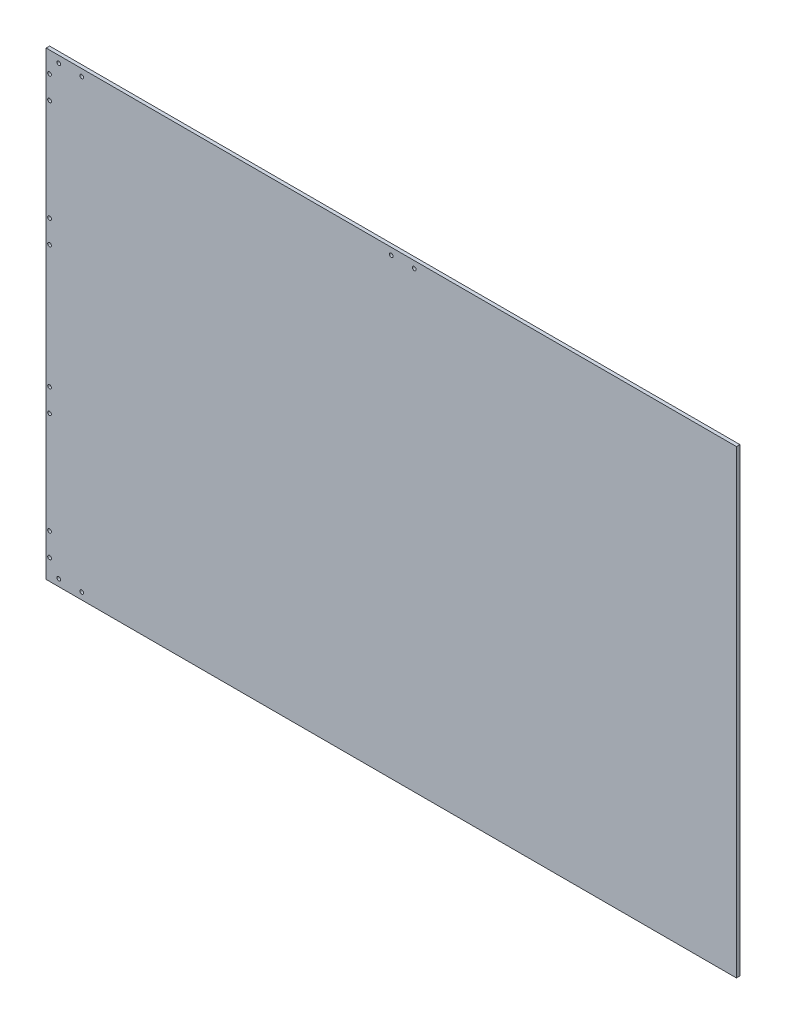
ISO-10303-21;
HEADER;
FILE_DESCRIPTION(('STEP AP214'),'2;1');
FILE_NAME('part.step','',(''),(''),'','','');
FILE_SCHEMA(('AUTOMOTIVE_DESIGN { 1 0 10303 214 1 1 1 1 }'));
ENDSEC;
DATA;
#1=APPLICATION_CONTEXT('core data for automotive mechanical design processes');
#2=APPLICATION_PROTOCOL_DEFINITION('international standard','automotive_design',2000,#1);
#3=PRODUCT_CONTEXT('',#1,'mechanical');
#4=PRODUCT('Part','Part','',(#3));
#5=PRODUCT_RELATED_PRODUCT_CATEGORY('part','',(#4));
#6=PRODUCT_DEFINITION_FORMATION('','',#4);
#7=PRODUCT_DEFINITION_CONTEXT('part definition',#1,'design');
#8=PRODUCT_DEFINITION('design','',#6,#7);
#9=PRODUCT_DEFINITION_SHAPE('','',#8);
#10=(LENGTH_UNIT() NAMED_UNIT(*) SI_UNIT(.MILLI.,.METRE.));
#11=(NAMED_UNIT(*) PLANE_ANGLE_UNIT() SI_UNIT($,.RADIAN.));
#12=(NAMED_UNIT(*) SI_UNIT($,.STERADIAN.) SOLID_ANGLE_UNIT());
#13=UNCERTAINTY_MEASURE_WITH_UNIT(LENGTH_MEASURE(1.E-05),#10,'distance_accuracy_value','');
#14=(GEOMETRIC_REPRESENTATION_CONTEXT(3) GLOBAL_UNCERTAINTY_ASSIGNED_CONTEXT((#13)) GLOBAL_UNIT_ASSIGNED_CONTEXT((#10,
#11,#12)) REPRESENTATION_CONTEXT('',''));
#15=CARTESIAN_POINT('',(0.,0.,0.));
#16=DIRECTION('',(0.,0.,1.));
#17=DIRECTION('',(1.,0.,0.));
#18=AXIS2_PLACEMENT_3D('',#15,#16,#17);
#19=CARTESIAN_POINT('',(300.,200.,3.));
#20=DIRECTION('',(-1.,0.,0.));
#21=DIRECTION('',(0.,0.,1.));
#22=AXIS2_PLACEMENT_3D('',#19,#20,#21);
#23=PLANE('',#22);
#24=DIRECTION('',(0.,1.,0.));
#25=VECTOR('',#24,1.);
#26=CARTESIAN_POINT('',(300.,200.,0.));
#27=LINE('',#26,#25);
#28=CARTESIAN_POINT('',(300.,-200.,0.));
#29=VERTEX_POINT('',#28);
#30=CARTESIAN_POINT('',(300.,200.,0.));
#31=VERTEX_POINT('',#30);
#32=EDGE_CURVE('E128',#29,#31,#27,.T.);
#33=ORIENTED_EDGE('',*,*,#32,.T.);
#34=DIRECTION('',(0.,0.,-1.));
#35=VECTOR('',#34,1.);
#36=CARTESIAN_POINT('',(300.,200.,3.));
#37=LINE('',#36,#35);
#38=CARTESIAN_POINT('',(300.,200.,3.));
#39=VERTEX_POINT('',#38);
#40=EDGE_CURVE('E12',#39,#31,#37,.T.);
#41=ORIENTED_EDGE('',*,*,#40,.F.);
#42=DIRECTION('',(0.,1.,0.));
#43=VECTOR('',#42,1.);
#44=CARTESIAN_POINT('',(300.,200.,3.));
#45=LINE('',#44,#43);
#46=CARTESIAN_POINT('',(300.,-200.,3.));
#47=VERTEX_POINT('',#46);
#48=EDGE_CURVE('E97',#47,#39,#45,.T.);
#49=ORIENTED_EDGE('',*,*,#48,.F.);
#50=DIRECTION('',(0.,0.,-1.));
#51=VECTOR('',#50,1.);
#52=CARTESIAN_POINT('',(300.,-200.,3.));
#53=LINE('',#52,#51);
#54=EDGE_CURVE('E108',#47,#29,#53,.T.);
#55=ORIENTED_EDGE('',*,*,#54,.T.);
#56=EDGE_LOOP('',(#33,#41,#49,#55));
#57=FACE_BOUND('',#56,.T.);
#58=ADVANCED_FACE('F46',(#57),#23,.F.);
#59=CARTESIAN_POINT('',(-300.,200.,3.));
#60=DIRECTION('',(0.,-1.,0.));
#61=DIRECTION('',(0.,0.,-1.));
#62=AXIS2_PLACEMENT_3D('',#59,#60,#61);
#63=PLANE('',#62);
#64=DIRECTION('',(-1.,0.,0.));
#65=VECTOR('',#64,1.);
#66=CARTESIAN_POINT('',(-300.,200.,0.));
#67=LINE('',#66,#65);
#68=CARTESIAN_POINT('',(-300.,200.,0.));
#69=VERTEX_POINT('',#68);
#70=EDGE_CURVE('E105',#31,#69,#67,.T.);
#71=ORIENTED_EDGE('',*,*,#70,.T.);
#72=DIRECTION('',(0.,0.,-1.));
#73=VECTOR('',#72,1.);
#74=CARTESIAN_POINT('',(-300.,200.,3.));
#75=LINE('',#74,#73);
#76=CARTESIAN_POINT('',(-300.,200.,3.));
#77=VERTEX_POINT('',#76);
#78=EDGE_CURVE('E53',#77,#69,#75,.T.);
#79=ORIENTED_EDGE('',*,*,#78,.F.);
#80=DIRECTION('',(-1.,0.,0.));
#81=VECTOR('',#80,1.);
#82=CARTESIAN_POINT('',(-300.,200.,3.));
#83=LINE('',#82,#81);
#84=EDGE_CURVE('E95',#39,#77,#83,.T.);
#85=ORIENTED_EDGE('',*,*,#84,.F.);
#86=ORIENTED_EDGE('',*,*,#40,.T.);
#87=EDGE_LOOP('',(#71,#79,#85,#86));
#88=FACE_BOUND('',#87,.T.);
#89=ADVANCED_FACE('F103',(#88),#63,.F.);
#90=CARTESIAN_POINT('',(-300.,200.,3.));
#91=DIRECTION('',(1.,0.,0.));
#92=DIRECTION('',(0.,0.,-1.));
#93=AXIS2_PLACEMENT_3D('',#90,#91,#92);
#94=PLANE('',#93);
#95=DIRECTION('',(0.,-1.,0.));
#96=VECTOR('',#95,1.);
#97=CARTESIAN_POINT('',(-300.,200.,0.));
#98=LINE('',#97,#96);
#99=CARTESIAN_POINT('',(-300.,-200.,0.));
#100=VERTEX_POINT('',#99);
#101=EDGE_CURVE('E79',#69,#100,#98,.T.);
#102=ORIENTED_EDGE('',*,*,#101,.T.);
#103=DIRECTION('',(0.,0.,-1.));
#104=VECTOR('',#103,1.);
#105=CARTESIAN_POINT('',(-300.,-200.,3.));
#106=LINE('',#105,#104);
#107=CARTESIAN_POINT('',(-300.,-200.,3.));
#108=VERTEX_POINT('',#107);
#109=EDGE_CURVE('E101',#108,#100,#106,.T.);
#110=ORIENTED_EDGE('',*,*,#109,.F.);
#111=DIRECTION('',(0.,-1.,0.));
#112=VECTOR('',#111,1.);
#113=CARTESIAN_POINT('',(-300.,200.,3.));
#114=LINE('',#113,#112);
#115=EDGE_CURVE('E93',#77,#108,#114,.T.);
#116=ORIENTED_EDGE('',*,*,#115,.F.);
#117=ORIENTED_EDGE('',*,*,#78,.T.);
#118=EDGE_LOOP('',(#102,#110,#116,#117));
#119=FACE_BOUND('',#118,.T.);
#120=ADVANCED_FACE('F104',(#119),#94,.F.);
#121=CARTESIAN_POINT('',(-300.,-200.,3.));
#122=DIRECTION('',(0.,1.,0.));
#123=DIRECTION('',(0.,0.,1.));
#124=AXIS2_PLACEMENT_3D('',#121,#122,#123);
#125=PLANE('',#124);
#126=DIRECTION('',(1.,0.,0.));
#127=VECTOR('',#126,1.);
#128=CARTESIAN_POINT('',(-300.,-200.,0.));
#129=LINE('',#128,#127);
#130=EDGE_CURVE('E83',#100,#29,#129,.T.);
#131=ORIENTED_EDGE('',*,*,#130,.T.);
#132=ORIENTED_EDGE('',*,*,#54,.F.);
#133=DIRECTION('',(1.,0.,0.));
#134=VECTOR('',#133,1.);
#135=CARTESIAN_POINT('',(-300.,-200.,3.));
#136=LINE('',#135,#134);
#137=EDGE_CURVE('E65',#108,#47,#136,.T.);
#138=ORIENTED_EDGE('',*,*,#137,.F.);
#139=ORIENTED_EDGE('',*,*,#109,.T.);
#140=EDGE_LOOP('',(#131,#132,#138,#139));
#141=FACE_BOUND('',#140,.T.);
#142=ADVANCED_FACE('F257',(#141),#125,.F.);
#143=CARTESIAN_POINT('',(0.,0.,3.));
#144=DIRECTION('',(0.,0.,1.));
#145=DIRECTION('',(1.,0.,0.));
#146=AXIS2_PLACEMENT_3D('',#143,#144,#145);
#147=PLANE('',#146);
#148=CARTESIAN_POINT('',(-297.,73.5000000000009,3.));
#149=DIRECTION('',(0.,0.,1.));
#150=DIRECTION('',(1.,0.,0.));
#151=AXIS2_PLACEMENT_3D('',#148,#149,#150);
#152=CIRCLE('',#151,1.59999999999997);
#153=CARTESIAN_POINT('',(-295.4,73.5000000000009,3.));
#154=VERTEX_POINT('',#153);
#155=EDGE_CURVE('E232',#154,#154,#152,.T.);
#156=ORIENTED_EDGE('',*,*,#155,.F.);
#157=EDGE_LOOP('',(#156));
#158=FACE_BOUND('',#157,.T.);
#159=CARTESIAN_POINT('',(-297.,53.5000000000009,3.));
#160=DIRECTION('',(0.,0.,1.));
#161=DIRECTION('',(1.,0.,0.));
#162=AXIS2_PLACEMENT_3D('',#159,#160,#161);
#163=CIRCLE('',#162,1.59999999999996);
#164=CARTESIAN_POINT('',(-295.4,53.5000000000009,3.));
#165=VERTEX_POINT('',#164);
#166=EDGE_CURVE('E229',#165,#165,#163,.T.);
#167=ORIENTED_EDGE('',*,*,#166,.F.);
#168=EDGE_LOOP('',(#167));
#169=FACE_BOUND('',#168,.T.);
#170=CARTESIAN_POINT('',(-297.,-53.4999999999992,3.));
#171=DIRECTION('',(0.,0.,1.));
#172=DIRECTION('',(1.,0.,0.));
#173=AXIS2_PLACEMENT_3D('',#170,#171,#172);
#174=CIRCLE('',#173,1.59999999999996);
#175=CARTESIAN_POINT('',(-295.4,-53.4999999999992,3.));
#176=VERTEX_POINT('',#175);
#177=EDGE_CURVE('E225',#176,#176,#174,.T.);
#178=ORIENTED_EDGE('',*,*,#177,.F.);
#179=EDGE_LOOP('',(#178));
#180=FACE_BOUND('',#179,.T.);
#181=CARTESIAN_POINT('',(-297.,-73.4999999999992,3.));
#182=DIRECTION('',(0.,0.,1.));
#183=DIRECTION('',(1.,0.,0.));
#184=AXIS2_PLACEMENT_3D('',#181,#182,#183);
#185=CIRCLE('',#184,1.59999999999997);
#186=CARTESIAN_POINT('',(-295.4,-73.4999999999992,3.));
#187=VERTEX_POINT('',#186);
#188=EDGE_CURVE('E213',#187,#187,#185,.T.);
#189=ORIENTED_EDGE('',*,*,#188,.F.);
#190=EDGE_LOOP('',(#189));
#191=FACE_BOUND('',#190,.T.);
#192=CARTESIAN_POINT('',(0.,194.,3.));
#193=DIRECTION('',(0.,0.,-1.));
#194=DIRECTION('',(-1.,0.,0.));
#195=AXIS2_PLACEMENT_3D('',#192,#193,#194);
#196=CIRCLE('',#195,1.59999999999999);
#197=CARTESIAN_POINT('',(-1.59999999999998,194.,3.));
#198=VERTEX_POINT('',#197);
#199=EDGE_CURVE('E140',#198,#198,#196,.T.);
#200=ORIENTED_EDGE('',*,*,#199,.T.);
#201=EDGE_LOOP('',(#200));
#202=FACE_BOUND('',#201,.T.);
#203=CARTESIAN_POINT('',(20.,194.,3.));
#204=DIRECTION('',(0.,0.,-1.));
#205=DIRECTION('',(-1.,0.,0.));
#206=AXIS2_PLACEMENT_3D('',#203,#204,#205);
#207=CIRCLE('',#206,1.59999999999999);
#208=CARTESIAN_POINT('',(18.4,194.,3.));
#209=VERTEX_POINT('',#208);
#210=EDGE_CURVE('E194',#209,#209,#207,.T.);
#211=ORIENTED_EDGE('',*,*,#210,.T.);
#212=EDGE_LOOP('',(#211));
#213=FACE_BOUND('',#212,.T.);
#214=CARTESIAN_POINT('',(-269.,194.000000000001,3.));
#215=DIRECTION('',(0.,0.,-1.));
#216=DIRECTION('',(-1.,0.,0.));
#217=AXIS2_PLACEMENT_3D('',#214,#215,#216);
#218=CIRCLE('',#217,1.59999999999996);
#219=CARTESIAN_POINT('',(-270.6,194.000000000001,3.));
#220=VERTEX_POINT('',#219);
#221=EDGE_CURVE('E133',#220,#220,#218,.T.);
#222=ORIENTED_EDGE('',*,*,#221,.T.);
#223=EDGE_LOOP('',(#222));
#224=FACE_BOUND('',#223,.T.);
#225=CARTESIAN_POINT('',(-289.,194.000000000001,3.));
#226=DIRECTION('',(0.,0.,-1.));
#227=DIRECTION('',(-1.,0.,0.));
#228=AXIS2_PLACEMENT_3D('',#225,#226,#227);
#229=CIRCLE('',#228,1.59999999999996);
#230=CARTESIAN_POINT('',(-290.6,194.000000000001,3.));
#231=VERTEX_POINT('',#230);
#232=EDGE_CURVE('E150',#231,#231,#229,.T.);
#233=ORIENTED_EDGE('',*,*,#232,.T.);
#234=EDGE_LOOP('',(#233));
#235=FACE_BOUND('',#234,.T.);
#236=CARTESIAN_POINT('',(-297.,182.,3.));
#237=DIRECTION('',(0.,0.,-1.));
#238=DIRECTION('',(-1.,0.,0.));
#239=AXIS2_PLACEMENT_3D('',#236,#237,#238);
#240=CIRCLE('',#239,1.59999999999996);
#241=CARTESIAN_POINT('',(-298.6,182.,3.));
#242=VERTEX_POINT('',#241);
#243=EDGE_CURVE('E155',#242,#242,#240,.T.);
#244=ORIENTED_EDGE('',*,*,#243,.T.);
#245=EDGE_LOOP('',(#244));
#246=FACE_BOUND('',#245,.T.);
#247=CARTESIAN_POINT('',(-297.,162.,3.));
#248=DIRECTION('',(0.,0.,-1.));
#249=DIRECTION('',(-1.,0.,0.));
#250=AXIS2_PLACEMENT_3D('',#247,#248,#249);
#251=CIRCLE('',#250,1.59999999999996);
#252=CARTESIAN_POINT('',(-298.6,162.,3.));
#253=VERTEX_POINT('',#252);
#254=EDGE_CURVE('E162',#253,#253,#251,.T.);
#255=ORIENTED_EDGE('',*,*,#254,.T.);
#256=EDGE_LOOP('',(#255));
#257=FACE_BOUND('',#256,.T.);
#258=CARTESIAN_POINT('',(-297.,-162.,3.));
#259=DIRECTION('',(0.,0.,-1.));
#260=DIRECTION('',(-1.,0.,0.));
#261=AXIS2_PLACEMENT_3D('',#258,#259,#260);
#262=CIRCLE('',#261,1.59999999999996);
#263=CARTESIAN_POINT('',(-298.6,-162.,3.));
#264=VERTEX_POINT('',#263);
#265=EDGE_CURVE('E175',#264,#264,#262,.T.);
#266=ORIENTED_EDGE('',*,*,#265,.T.);
#267=EDGE_LOOP('',(#266));
#268=FACE_BOUND('',#267,.T.);
#269=CARTESIAN_POINT('',(-297.,-182.,3.));
#270=DIRECTION('',(0.,0.,-1.));
#271=DIRECTION('',(-1.,0.,0.));
#272=AXIS2_PLACEMENT_3D('',#269,#270,#271);
#273=CIRCLE('',#272,1.59999999999996);
#274=CARTESIAN_POINT('',(-298.6,-182.,3.));
#275=VERTEX_POINT('',#274);
#276=EDGE_CURVE('E177',#275,#275,#273,.T.);
#277=ORIENTED_EDGE('',*,*,#276,.T.);
#278=EDGE_LOOP('',(#277));
#279=FACE_BOUND('',#278,.T.);
#280=CARTESIAN_POINT('',(-289.,-194.,3.));
#281=DIRECTION('',(0.,0.,-1.));
#282=DIRECTION('',(-1.,0.,0.));
#283=AXIS2_PLACEMENT_3D('',#280,#281,#282);
#284=CIRCLE('',#283,1.59999999999996);
#285=CARTESIAN_POINT('',(-290.6,-194.,3.));
#286=VERTEX_POINT('',#285);
#287=EDGE_CURVE('E190',#286,#286,#284,.T.);
#288=ORIENTED_EDGE('',*,*,#287,.T.);
#289=EDGE_LOOP('',(#288));
#290=FACE_BOUND('',#289,.T.);
#291=CARTESIAN_POINT('',(-269.,-194.,3.));
#292=DIRECTION('',(0.,0.,-1.));
#293=DIRECTION('',(-1.,0.,0.));
#294=AXIS2_PLACEMENT_3D('',#291,#292,#293);
#295=CIRCLE('',#294,1.59999999999996);
#296=CARTESIAN_POINT('',(-270.6,-194.,3.));
#297=VERTEX_POINT('',#296);
#298=EDGE_CURVE('E121',#297,#297,#295,.T.);
#299=ORIENTED_EDGE('',*,*,#298,.T.);
#300=EDGE_LOOP('',(#299));
#301=FACE_BOUND('',#300,.T.);
#302=ORIENTED_EDGE('',*,*,#48,.T.);
#303=ORIENTED_EDGE('',*,*,#84,.T.);
#304=ORIENTED_EDGE('',*,*,#115,.T.);
#305=ORIENTED_EDGE('',*,*,#137,.T.);
#306=EDGE_LOOP('',(#302,#303,#304,#305));
#307=FACE_BOUND('',#306,.T.);
#308=ADVANCED_FACE('F94',(#158,#169,#180,#191,#202,#213,#224,#235,#246,#257,#268,#279,#290,#301,
#307),#147,.T.);
#309=CARTESIAN_POINT('',(0.,0.,0.));
#310=DIRECTION('',(0.,0.,1.));
#311=DIRECTION('',(1.,0.,0.));
#312=AXIS2_PLACEMENT_3D('',#309,#310,#311);
#313=PLANE('',#312);
#314=CARTESIAN_POINT('',(-297.,73.5000000000009,0.));
#315=DIRECTION('',(0.,0.,1.));
#316=DIRECTION('',(1.,0.,0.));
#317=AXIS2_PLACEMENT_3D('',#314,#315,#316);
#318=CIRCLE('',#317,1.59999999999997);
#319=CARTESIAN_POINT('',(-295.4,73.5000000000009,0.));
#320=VERTEX_POINT('',#319);
#321=EDGE_CURVE('E200',#320,#320,#318,.T.);
#322=ORIENTED_EDGE('',*,*,#321,.T.);
#323=EDGE_LOOP('',(#322));
#324=FACE_BOUND('',#323,.T.);
#325=CARTESIAN_POINT('',(-297.,53.5000000000009,0.));
#326=DIRECTION('',(0.,0.,1.));
#327=DIRECTION('',(1.,0.,0.));
#328=AXIS2_PLACEMENT_3D('',#325,#326,#327);
#329=CIRCLE('',#328,1.59999999999996);
#330=CARTESIAN_POINT('',(-295.4,53.5000000000009,0.));
#331=VERTEX_POINT('',#330);
#332=EDGE_CURVE('E227',#331,#331,#329,.T.);
#333=ORIENTED_EDGE('',*,*,#332,.T.);
#334=EDGE_LOOP('',(#333));
#335=FACE_BOUND('',#334,.T.);
#336=CARTESIAN_POINT('',(-297.,-53.4999999999992,0.));
#337=DIRECTION('',(0.,0.,1.));
#338=DIRECTION('',(1.,0.,0.));
#339=AXIS2_PLACEMENT_3D('',#336,#337,#338);
#340=CIRCLE('',#339,1.59999999999996);
#341=CARTESIAN_POINT('',(-295.4,-53.4999999999992,0.));
#342=VERTEX_POINT('',#341);
#343=EDGE_CURVE('E216',#342,#342,#340,.T.);
#344=ORIENTED_EDGE('',*,*,#343,.T.);
#345=EDGE_LOOP('',(#344));
#346=FACE_BOUND('',#345,.T.);
#347=CARTESIAN_POINT('',(-297.,-73.4999999999992,0.));
#348=DIRECTION('',(0.,0.,1.));
#349=DIRECTION('',(1.,0.,0.));
#350=AXIS2_PLACEMENT_3D('',#347,#348,#349);
#351=CIRCLE('',#350,1.59999999999997);
#352=CARTESIAN_POINT('',(-295.4,-73.4999999999992,0.));
#353=VERTEX_POINT('',#352);
#354=EDGE_CURVE('E209',#353,#353,#351,.T.);
#355=ORIENTED_EDGE('',*,*,#354,.T.);
#356=EDGE_LOOP('',(#355));
#357=FACE_BOUND('',#356,.T.);
#358=CARTESIAN_POINT('',(0.,194.,0.));
#359=DIRECTION('',(0.,0.,-1.));
#360=DIRECTION('',(-1.,0.,0.));
#361=AXIS2_PLACEMENT_3D('',#358,#359,#360);
#362=CIRCLE('',#361,1.59999999999999);
#363=CARTESIAN_POINT('',(-1.59999999999998,194.,0.));
#364=VERTEX_POINT('',#363);
#365=EDGE_CURVE('E205',#364,#364,#362,.T.);
#366=ORIENTED_EDGE('',*,*,#365,.F.);
#367=EDGE_LOOP('',(#366));
#368=FACE_BOUND('',#367,.T.);
#369=CARTESIAN_POINT('',(20.,194.,0.));
#370=DIRECTION('',(0.,0.,-1.));
#371=DIRECTION('',(-1.,0.,0.));
#372=AXIS2_PLACEMENT_3D('',#369,#370,#371);
#373=CIRCLE('',#372,1.59999999999999);
#374=CARTESIAN_POINT('',(18.4,194.,0.));
#375=VERTEX_POINT('',#374);
#376=EDGE_CURVE('E197',#375,#375,#373,.T.);
#377=ORIENTED_EDGE('',*,*,#376,.F.);
#378=EDGE_LOOP('',(#377));
#379=FACE_BOUND('',#378,.T.);
#380=CARTESIAN_POINT('',(-269.,194.000000000001,0.));
#381=DIRECTION('',(0.,0.,-1.));
#382=DIRECTION('',(-1.,0.,0.));
#383=AXIS2_PLACEMENT_3D('',#380,#381,#382);
#384=CIRCLE('',#383,1.59999999999996);
#385=CARTESIAN_POINT('',(-270.6,194.000000000001,0.));
#386=VERTEX_POINT('',#385);
#387=EDGE_CURVE('E137',#386,#386,#384,.T.);
#388=ORIENTED_EDGE('',*,*,#387,.F.);
#389=EDGE_LOOP('',(#388));
#390=FACE_BOUND('',#389,.T.);
#391=CARTESIAN_POINT('',(-289.,194.000000000001,0.));
#392=DIRECTION('',(0.,0.,-1.));
#393=DIRECTION('',(-1.,0.,0.));
#394=AXIS2_PLACEMENT_3D('',#391,#392,#393);
#395=CIRCLE('',#394,1.59999999999996);
#396=CARTESIAN_POINT('',(-290.6,194.000000000001,0.));
#397=VERTEX_POINT('',#396);
#398=EDGE_CURVE('E154',#397,#397,#395,.T.);
#399=ORIENTED_EDGE('',*,*,#398,.F.);
#400=EDGE_LOOP('',(#399));
#401=FACE_BOUND('',#400,.T.);
#402=CARTESIAN_POINT('',(-297.,182.,0.));
#403=DIRECTION('',(0.,0.,-1.));
#404=DIRECTION('',(-1.,0.,0.));
#405=AXIS2_PLACEMENT_3D('',#402,#403,#404);
#406=CIRCLE('',#405,1.59999999999996);
#407=CARTESIAN_POINT('',(-298.6,182.,0.));
#408=VERTEX_POINT('',#407);
#409=EDGE_CURVE('E156',#408,#408,#406,.T.);
#410=ORIENTED_EDGE('',*,*,#409,.F.);
#411=EDGE_LOOP('',(#410));
#412=FACE_BOUND('',#411,.T.);
#413=CARTESIAN_POINT('',(-297.,162.,0.));
#414=DIRECTION('',(0.,0.,-1.));
#415=DIRECTION('',(-1.,0.,0.));
#416=AXIS2_PLACEMENT_3D('',#413,#414,#415);
#417=CIRCLE('',#416,1.59999999999996);
#418=CARTESIAN_POINT('',(-298.6,162.,0.));
#419=VERTEX_POINT('',#418);
#420=EDGE_CURVE('E170',#419,#419,#417,.T.);
#421=ORIENTED_EDGE('',*,*,#420,.F.);
#422=EDGE_LOOP('',(#421));
#423=FACE_BOUND('',#422,.T.);
#424=CARTESIAN_POINT('',(-297.,-162.,0.));
#425=DIRECTION('',(0.,0.,-1.));
#426=DIRECTION('',(-1.,0.,0.));
#427=AXIS2_PLACEMENT_3D('',#424,#425,#426);
#428=CIRCLE('',#427,1.59999999999996);
#429=CARTESIAN_POINT('',(-298.6,-162.,0.));
#430=VERTEX_POINT('',#429);
#431=EDGE_CURVE('E180',#430,#430,#428,.T.);
#432=ORIENTED_EDGE('',*,*,#431,.F.);
#433=EDGE_LOOP('',(#432));
#434=FACE_BOUND('',#433,.T.);
#435=CARTESIAN_POINT('',(-297.,-182.,0.));
#436=DIRECTION('',(0.,0.,-1.));
#437=DIRECTION('',(-1.,0.,0.));
#438=AXIS2_PLACEMENT_3D('',#435,#436,#437);
#439=CIRCLE('',#438,1.59999999999996);
#440=CARTESIAN_POINT('',(-298.6,-182.,0.));
#441=VERTEX_POINT('',#440);
#442=EDGE_CURVE('E183',#441,#441,#439,.T.);
#443=ORIENTED_EDGE('',*,*,#442,.F.);
#444=EDGE_LOOP('',(#443));
#445=FACE_BOUND('',#444,.T.);
#446=CARTESIAN_POINT('',(-289.,-194.,0.));
#447=DIRECTION('',(0.,0.,-1.));
#448=DIRECTION('',(-1.,0.,0.));
#449=AXIS2_PLACEMENT_3D('',#446,#447,#448);
#450=CIRCLE('',#449,1.59999999999996);
#451=CARTESIAN_POINT('',(-290.6,-194.,0.));
#452=VERTEX_POINT('',#451);
#453=EDGE_CURVE('E123',#452,#452,#450,.T.);
#454=ORIENTED_EDGE('',*,*,#453,.F.);
#455=EDGE_LOOP('',(#454));
#456=FACE_BOUND('',#455,.T.);
#457=CARTESIAN_POINT('',(-269.,-194.,0.));
#458=DIRECTION('',(0.,0.,-1.));
#459=DIRECTION('',(-1.,0.,0.));
#460=AXIS2_PLACEMENT_3D('',#457,#458,#459);
#461=CIRCLE('',#460,1.59999999999996);
#462=CARTESIAN_POINT('',(-270.6,-194.,0.));
#463=VERTEX_POINT('',#462);
#464=EDGE_CURVE('E125',#463,#463,#461,.T.);
#465=ORIENTED_EDGE('',*,*,#464,.F.);
#466=EDGE_LOOP('',(#465));
#467=FACE_BOUND('',#466,.T.);
#468=ORIENTED_EDGE('',*,*,#32,.F.);
#469=ORIENTED_EDGE('',*,*,#130,.F.);
#470=ORIENTED_EDGE('',*,*,#101,.F.);
#471=ORIENTED_EDGE('',*,*,#70,.F.);
#472=EDGE_LOOP('',(#468,#469,#470,#471));
#473=FACE_BOUND('',#472,.T.);
#474=ADVANCED_FACE('F242',(#324,#335,#346,#357,#368,#379,#390,#401,#412,#423,#434,#445,#456,
#467,#473),#313,.F.);
#475=CARTESIAN_POINT('',(-269.,-194.,3.));
#476=DIRECTION('',(0.,0.,-1.));
#477=DIRECTION('',(-1.,0.,0.));
#478=AXIS2_PLACEMENT_3D('',#475,#476,#477);
#479=CYLINDRICAL_SURFACE('',#478,1.59999999999996);
#480=ORIENTED_EDGE('',*,*,#298,.F.);
#481=EDGE_LOOP('',(#480));
#482=FACE_BOUND('',#481,.T.);
#483=ORIENTED_EDGE('',*,*,#464,.T.);
#484=EDGE_LOOP('',(#483));
#485=FACE_BOUND('',#484,.T.);
#486=ADVANCED_FACE('F285',(#482,#485),#479,.F.);
#487=CARTESIAN_POINT('',(-289.,-194.,3.));
#488=DIRECTION('',(0.,0.,-1.));
#489=DIRECTION('',(-1.,0.,0.));
#490=AXIS2_PLACEMENT_3D('',#487,#488,#489);
#491=CYLINDRICAL_SURFACE('',#490,1.59999999999996);
#492=ORIENTED_EDGE('',*,*,#287,.F.);
#493=EDGE_LOOP('',(#492));
#494=FACE_BOUND('',#493,.T.);
#495=ORIENTED_EDGE('',*,*,#453,.T.);
#496=EDGE_LOOP('',(#495));
#497=FACE_BOUND('',#496,.T.);
#498=ADVANCED_FACE('F290',(#494,#497),#491,.F.);
#499=CARTESIAN_POINT('',(-297.,-182.,3.));
#500=DIRECTION('',(0.,0.,-1.));
#501=DIRECTION('',(-1.,0.,0.));
#502=AXIS2_PLACEMENT_3D('',#499,#500,#501);
#503=CYLINDRICAL_SURFACE('',#502,1.59999999999996);
#504=ORIENTED_EDGE('',*,*,#276,.F.);
#505=EDGE_LOOP('',(#504));
#506=FACE_BOUND('',#505,.T.);
#507=ORIENTED_EDGE('',*,*,#442,.T.);
#508=EDGE_LOOP('',(#507));
#509=FACE_BOUND('',#508,.T.);
#510=ADVANCED_FACE('F334',(#506,#509),#503,.F.);
#511=CARTESIAN_POINT('',(-297.,-162.,3.));
#512=DIRECTION('',(0.,0.,-1.));
#513=DIRECTION('',(-1.,0.,0.));
#514=AXIS2_PLACEMENT_3D('',#511,#512,#513);
#515=CYLINDRICAL_SURFACE('',#514,1.59999999999996);
#516=ORIENTED_EDGE('',*,*,#265,.F.);
#517=EDGE_LOOP('',(#516));
#518=FACE_BOUND('',#517,.T.);
#519=ORIENTED_EDGE('',*,*,#431,.T.);
#520=EDGE_LOOP('',(#519));
#521=FACE_BOUND('',#520,.T.);
#522=ADVANCED_FACE('F330',(#518,#521),#515,.F.);
#523=CARTESIAN_POINT('',(-297.,162.,3.));
#524=DIRECTION('',(0.,0.,-1.));
#525=DIRECTION('',(-1.,0.,0.));
#526=AXIS2_PLACEMENT_3D('',#523,#524,#525);
#527=CYLINDRICAL_SURFACE('',#526,1.59999999999996);
#528=ORIENTED_EDGE('',*,*,#254,.F.);
#529=EDGE_LOOP('',(#528));
#530=FACE_BOUND('',#529,.T.);
#531=ORIENTED_EDGE('',*,*,#420,.T.);
#532=EDGE_LOOP('',(#531));
#533=FACE_BOUND('',#532,.T.);
#534=ADVANCED_FACE('F323',(#530,#533),#527,.F.);
#535=CARTESIAN_POINT('',(-297.,182.,3.));
#536=DIRECTION('',(0.,0.,-1.));
#537=DIRECTION('',(-1.,0.,0.));
#538=AXIS2_PLACEMENT_3D('',#535,#536,#537);
#539=CYLINDRICAL_SURFACE('',#538,1.59999999999996);
#540=ORIENTED_EDGE('',*,*,#243,.F.);
#541=EDGE_LOOP('',(#540));
#542=FACE_BOUND('',#541,.T.);
#543=ORIENTED_EDGE('',*,*,#409,.T.);
#544=EDGE_LOOP('',(#543));
#545=FACE_BOUND('',#544,.T.);
#546=ADVANCED_FACE('F322',(#542,#545),#539,.F.);
#547=CARTESIAN_POINT('',(-289.,194.000000000001,3.));
#548=DIRECTION('',(0.,0.,-1.));
#549=DIRECTION('',(-1.,0.,0.));
#550=AXIS2_PLACEMENT_3D('',#547,#548,#549);
#551=CYLINDRICAL_SURFACE('',#550,1.59999999999996);
#552=ORIENTED_EDGE('',*,*,#232,.F.);
#553=EDGE_LOOP('',(#552));
#554=FACE_BOUND('',#553,.T.);
#555=ORIENTED_EDGE('',*,*,#398,.T.);
#556=EDGE_LOOP('',(#555));
#557=FACE_BOUND('',#556,.T.);
#558=ADVANCED_FACE('F320',(#554,#557),#551,.F.);
#559=CARTESIAN_POINT('',(-269.,194.000000000001,3.));
#560=DIRECTION('',(0.,0.,-1.));
#561=DIRECTION('',(-1.,0.,0.));
#562=AXIS2_PLACEMENT_3D('',#559,#560,#561);
#563=CYLINDRICAL_SURFACE('',#562,1.59999999999996);
#564=ORIENTED_EDGE('',*,*,#221,.F.);
#565=EDGE_LOOP('',(#564));
#566=FACE_BOUND('',#565,.T.);
#567=ORIENTED_EDGE('',*,*,#387,.T.);
#568=EDGE_LOOP('',(#567));
#569=FACE_BOUND('',#568,.T.);
#570=ADVANCED_FACE('F312',(#566,#569),#563,.F.);
#571=CARTESIAN_POINT('',(20.,194.,3.));
#572=DIRECTION('',(0.,0.,-1.));
#573=DIRECTION('',(-1.,0.,0.));
#574=AXIS2_PLACEMENT_3D('',#571,#572,#573);
#575=CYLINDRICAL_SURFACE('',#574,1.59999999999999);
#576=ORIENTED_EDGE('',*,*,#210,.F.);
#577=EDGE_LOOP('',(#576));
#578=FACE_BOUND('',#577,.T.);
#579=ORIENTED_EDGE('',*,*,#376,.T.);
#580=EDGE_LOOP('',(#579));
#581=FACE_BOUND('',#580,.T.);
#582=ADVANCED_FACE('F317',(#578,#581),#575,.F.);
#583=CARTESIAN_POINT('',(0.,194.,3.));
#584=DIRECTION('',(0.,0.,-1.));
#585=DIRECTION('',(-1.,0.,0.));
#586=AXIS2_PLACEMENT_3D('',#583,#584,#585);
#587=CYLINDRICAL_SURFACE('',#586,1.59999999999999);
#588=ORIENTED_EDGE('',*,*,#199,.F.);
#589=EDGE_LOOP('',(#588));
#590=FACE_BOUND('',#589,.T.);
#591=ORIENTED_EDGE('',*,*,#365,.T.);
#592=EDGE_LOOP('',(#591));
#593=FACE_BOUND('',#592,.T.);
#594=ADVANCED_FACE('F344',(#590,#593),#587,.F.);
#595=CARTESIAN_POINT('',(-297.,-73.4999999999992,0.));
#596=DIRECTION('',(0.,0.,1.));
#597=DIRECTION('',(1.,0.,0.));
#598=AXIS2_PLACEMENT_3D('',#595,#596,#597);
#599=CYLINDRICAL_SURFACE('',#598,1.59999999999997);
#600=ORIENTED_EDGE('',*,*,#354,.F.);
#601=EDGE_LOOP('',(#600));
#602=FACE_BOUND('',#601,.T.);
#603=ORIENTED_EDGE('',*,*,#188,.T.);
#604=EDGE_LOOP('',(#603));
#605=FACE_BOUND('',#604,.T.);
#606=ADVANCED_FACE('F349',(#602,#605),#599,.F.);
#607=CARTESIAN_POINT('',(-297.,-53.4999999999992,0.));
#608=DIRECTION('',(0.,0.,1.));
#609=DIRECTION('',(1.,0.,0.));
#610=AXIS2_PLACEMENT_3D('',#607,#608,#609);
#611=CYLINDRICAL_SURFACE('',#610,1.59999999999996);
#612=ORIENTED_EDGE('',*,*,#343,.F.);
#613=EDGE_LOOP('',(#612));
#614=FACE_BOUND('',#613,.T.);
#615=ORIENTED_EDGE('',*,*,#177,.T.);
#616=EDGE_LOOP('',(#615));
#617=FACE_BOUND('',#616,.T.);
#618=ADVANCED_FACE('F352',(#614,#617),#611,.F.);
#619=CARTESIAN_POINT('',(-297.,53.5000000000009,0.));
#620=DIRECTION('',(0.,0.,1.));
#621=DIRECTION('',(1.,0.,0.));
#622=AXIS2_PLACEMENT_3D('',#619,#620,#621);
#623=CYLINDRICAL_SURFACE('',#622,1.59999999999996);
#624=ORIENTED_EDGE('',*,*,#332,.F.);
#625=EDGE_LOOP('',(#624));
#626=FACE_BOUND('',#625,.T.);
#627=ORIENTED_EDGE('',*,*,#166,.T.);
#628=EDGE_LOOP('',(#627));
#629=FACE_BOUND('',#628,.T.);
#630=ADVANCED_FACE('F249',(#626,#629),#623,.F.);
#631=CARTESIAN_POINT('',(-297.,73.5000000000009,0.));
#632=DIRECTION('',(0.,0.,1.));
#633=DIRECTION('',(1.,0.,0.));
#634=AXIS2_PLACEMENT_3D('',#631,#632,#633);
#635=CYLINDRICAL_SURFACE('',#634,1.59999999999997);
#636=ORIENTED_EDGE('',*,*,#321,.F.);
#637=EDGE_LOOP('',(#636));
#638=FACE_BOUND('',#637,.T.);
#639=ORIENTED_EDGE('',*,*,#155,.T.);
#640=EDGE_LOOP('',(#639));
#641=FACE_BOUND('',#640,.T.);
#642=ADVANCED_FACE('F250',(#638,#641),#635,.F.);
#643=CLOSED_SHELL('',(#58,#89,#120,#142,#308,#474,#486,#498,#510,#522,#534,#546,#558,#570,#582,
#594,#606,#618,#630,#642));
#644=MANIFOLD_SOLID_BREP('B2',#643);
#645=ADVANCED_BREP_SHAPE_REPRESENTATION('',(#18,#644),#14);
#646=SHAPE_DEFINITION_REPRESENTATION(#9,#645);
ENDSEC;
END-ISO-10303-21;
